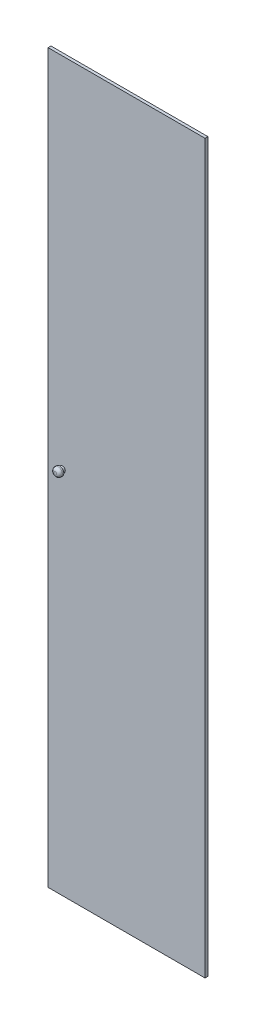
ISO-10303-21;
HEADER;
FILE_DESCRIPTION(('STEP AP214'),'2;1');
FILE_NAME('part.step','',(''),(''),'','','');
FILE_SCHEMA(('AUTOMOTIVE_DESIGN { 1 0 10303 214 1 1 1 1 }'));
ENDSEC;
DATA;
#1=APPLICATION_CONTEXT('core data for automotive mechanical design processes');
#2=APPLICATION_PROTOCOL_DEFINITION('international standard','automotive_design',2000,#1);
#3=PRODUCT_CONTEXT('',#1,'mechanical');
#4=PRODUCT('Part','Part','',(#3));
#5=PRODUCT_RELATED_PRODUCT_CATEGORY('part','',(#4));
#6=PRODUCT_DEFINITION_FORMATION('','',#4);
#7=PRODUCT_DEFINITION_CONTEXT('part definition',#1,'design');
#8=PRODUCT_DEFINITION('design','',#6,#7);
#9=PRODUCT_DEFINITION_SHAPE('','',#8);
#10=(LENGTH_UNIT() NAMED_UNIT(*) SI_UNIT(.MILLI.,.METRE.));
#11=(NAMED_UNIT(*) PLANE_ANGLE_UNIT() SI_UNIT($,.RADIAN.));
#12=(NAMED_UNIT(*) SI_UNIT($,.STERADIAN.) SOLID_ANGLE_UNIT());
#13=UNCERTAINTY_MEASURE_WITH_UNIT(LENGTH_MEASURE(1.E-05),#10,'distance_accuracy_value','');
#14=(GEOMETRIC_REPRESENTATION_CONTEXT(3) GLOBAL_UNCERTAINTY_ASSIGNED_CONTEXT((#13)) GLOBAL_UNIT_ASSIGNED_CONTEXT((#10,
#11,#12)) REPRESENTATION_CONTEXT('',''));
#15=CARTESIAN_POINT('',(0.,0.,0.));
#16=DIRECTION('',(0.,0.,1.));
#17=DIRECTION('',(1.,0.,0.));
#18=AXIS2_PLACEMENT_3D('',#15,#16,#17);
#19=CARTESIAN_POINT('',(-275.,-1275.,10.));
#20=DIRECTION('',(1.,0.,0.));
#21=DIRECTION('',(0.,1.,0.));
#22=AXIS2_PLACEMENT_3D('',#19,#20,#21);
#23=PLANE('',#22);
#24=DIRECTION('',(0.,-1.,0.));
#25=VECTOR('',#24,1.);
#26=CARTESIAN_POINT('',(-275.,-1275.,0.));
#27=LINE('',#26,#25);
#28=CARTESIAN_POINT('',(-275.,1275.,0.));
#29=VERTEX_POINT('',#28);
#30=CARTESIAN_POINT('',(-275.,-1275.,0.));
#31=VERTEX_POINT('',#30);
#32=EDGE_CURVE('E102',#29,#31,#27,.T.);
#33=ORIENTED_EDGE('',*,*,#32,.T.);
#34=DIRECTION('',(0.,0.,-1.));
#35=VECTOR('',#34,1.);
#36=CARTESIAN_POINT('',(-275.,-1275.,10.));
#37=LINE('',#36,#35);
#38=CARTESIAN_POINT('',(-275.,-1275.,10.));
#39=VERTEX_POINT('',#38);
#40=EDGE_CURVE('E93',#39,#31,#37,.T.);
#41=ORIENTED_EDGE('',*,*,#40,.F.);
#42=DIRECTION('',(0.,-1.,0.));
#43=VECTOR('',#42,1.);
#44=CARTESIAN_POINT('',(-275.,-1275.,10.));
#45=LINE('',#44,#43);
#46=CARTESIAN_POINT('',(-275.,1275.,10.));
#47=VERTEX_POINT('',#46);
#48=EDGE_CURVE('E87',#47,#39,#45,.T.);
#49=ORIENTED_EDGE('',*,*,#48,.F.);
#50=DIRECTION('',(0.,0.,-1.));
#51=VECTOR('',#50,1.);
#52=CARTESIAN_POINT('',(-275.,1275.,10.));
#53=LINE('',#52,#51);
#54=EDGE_CURVE('E98',#47,#29,#53,.T.);
#55=ORIENTED_EDGE('',*,*,#54,.T.);
#56=EDGE_LOOP('',(#33,#41,#49,#55));
#57=FACE_BOUND('',#56,.T.);
#58=ADVANCED_FACE('F34',(#57),#23,.F.);
#59=CARTESIAN_POINT('',(275.,-1275.,10.));
#60=DIRECTION('',(0.,1.,0.));
#61=DIRECTION('',(0.,0.,1.));
#62=AXIS2_PLACEMENT_3D('',#59,#60,#61);
#63=PLANE('',#62);
#64=DIRECTION('',(1.,0.,0.));
#65=VECTOR('',#64,1.);
#66=CARTESIAN_POINT('',(275.,-1275.,0.));
#67=LINE('',#66,#65);
#68=CARTESIAN_POINT('',(275.,-1275.,0.));
#69=VERTEX_POINT('',#68);
#70=EDGE_CURVE('E92',#31,#69,#67,.T.);
#71=ORIENTED_EDGE('',*,*,#70,.T.);
#72=DIRECTION('',(0.,0.,-1.));
#73=VECTOR('',#72,1.);
#74=CARTESIAN_POINT('',(275.,-1275.,10.));
#75=LINE('',#74,#73);
#76=CARTESIAN_POINT('',(275.,-1275.,10.));
#77=VERTEX_POINT('',#76);
#78=EDGE_CURVE('E90',#77,#69,#75,.T.);
#79=ORIENTED_EDGE('',*,*,#78,.F.);
#80=DIRECTION('',(1.,0.,0.));
#81=VECTOR('',#80,1.);
#82=CARTESIAN_POINT('',(275.,-1275.,10.));
#83=LINE('',#82,#81);
#84=EDGE_CURVE('E82',#39,#77,#83,.T.);
#85=ORIENTED_EDGE('',*,*,#84,.F.);
#86=ORIENTED_EDGE('',*,*,#40,.T.);
#87=EDGE_LOOP('',(#71,#79,#85,#86));
#88=FACE_BOUND('',#87,.T.);
#89=ADVANCED_FACE('F91',(#88),#63,.F.);
#90=CARTESIAN_POINT('',(275.,-1275.,10.));
#91=DIRECTION('',(-1.,0.,0.));
#92=DIRECTION('',(0.,0.,1.));
#93=AXIS2_PLACEMENT_3D('',#90,#91,#92);
#94=PLANE('',#93);
#95=DIRECTION('',(0.,1.,0.));
#96=VECTOR('',#95,1.);
#97=CARTESIAN_POINT('',(275.,-1275.,0.));
#98=LINE('',#97,#96);
#99=CARTESIAN_POINT('',(275.,1275.,0.));
#100=VERTEX_POINT('',#99);
#101=EDGE_CURVE('E68',#69,#100,#98,.T.);
#102=ORIENTED_EDGE('',*,*,#101,.T.);
#103=DIRECTION('',(0.,0.,-1.));
#104=VECTOR('',#103,1.);
#105=CARTESIAN_POINT('',(275.,1275.,10.));
#106=LINE('',#105,#104);
#107=CARTESIAN_POINT('',(275.,1275.,10.));
#108=VERTEX_POINT('',#107);
#109=EDGE_CURVE('E94',#108,#100,#106,.T.);
#110=ORIENTED_EDGE('',*,*,#109,.F.);
#111=DIRECTION('',(0.,1.,0.));
#112=VECTOR('',#111,1.);
#113=CARTESIAN_POINT('',(275.,-1275.,10.));
#114=LINE('',#113,#112);
#115=EDGE_CURVE('E85',#77,#108,#114,.T.);
#116=ORIENTED_EDGE('',*,*,#115,.F.);
#117=ORIENTED_EDGE('',*,*,#78,.T.);
#118=EDGE_LOOP('',(#102,#110,#116,#117));
#119=FACE_BOUND('',#118,.T.);
#120=ADVANCED_FACE('F96',(#119),#94,.F.);
#121=CARTESIAN_POINT('',(275.,1275.,10.));
#122=DIRECTION('',(0.,-1.,0.));
#123=DIRECTION('',(0.,0.,-1.));
#124=AXIS2_PLACEMENT_3D('',#121,#122,#123);
#125=PLANE('',#124);
#126=DIRECTION('',(-1.,0.,0.));
#127=VECTOR('',#126,1.);
#128=CARTESIAN_POINT('',(275.,1275.,0.));
#129=LINE('',#128,#127);
#130=EDGE_CURVE('E74',#100,#29,#129,.T.);
#131=ORIENTED_EDGE('',*,*,#130,.T.);
#132=ORIENTED_EDGE('',*,*,#54,.F.);
#133=DIRECTION('',(-1.,0.,0.));
#134=VECTOR('',#133,1.);
#135=CARTESIAN_POINT('',(275.,1275.,10.));
#136=LINE('',#135,#134);
#137=EDGE_CURVE('E51',#108,#47,#136,.T.);
#138=ORIENTED_EDGE('',*,*,#137,.F.);
#139=ORIENTED_EDGE('',*,*,#109,.T.);
#140=EDGE_LOOP('',(#131,#132,#138,#139));
#141=FACE_BOUND('',#140,.T.);
#142=ADVANCED_FACE('F134',(#141),#125,.F.);
#143=CARTESIAN_POINT('',(0.,0.,10.));
#144=DIRECTION('',(0.,0.,1.));
#145=DIRECTION('',(1.,0.,0.));
#146=AXIS2_PLACEMENT_3D('',#143,#144,#145);
#147=PLANE('',#146);
#148=CARTESIAN_POINT('',(-225.,20.,10.));
#149=DIRECTION('',(0.,0.,1.));
#150=DIRECTION('',(1.,0.,0.));
#151=AXIS2_PLACEMENT_3D('',#148,#149,#150);
#152=CIRCLE('',#151,10.);
#153=CARTESIAN_POINT('',(-215.,20.,10.));
#154=VERTEX_POINT('',#153);
#155=EDGE_CURVE('E222',#154,#154,#152,.T.);
#156=ORIENTED_EDGE('',*,*,#155,.F.);
#157=EDGE_LOOP('',(#156));
#158=FACE_BOUND('',#157,.T.);
#159=ORIENTED_EDGE('',*,*,#48,.T.);
#160=ORIENTED_EDGE('',*,*,#84,.T.);
#161=ORIENTED_EDGE('',*,*,#115,.T.);
#162=ORIENTED_EDGE('',*,*,#137,.T.);
#163=EDGE_LOOP('',(#159,#160,#161,#162));
#164=FACE_BOUND('',#163,.T.);
#165=ADVANCED_FACE('F83',(#158,#164),#147,.T.);
#166=CARTESIAN_POINT('',(0.,0.,0.));
#167=DIRECTION('',(0.,0.,1.));
#168=DIRECTION('',(1.,0.,0.));
#169=AXIS2_PLACEMENT_3D('',#166,#167,#168);
#170=PLANE('',#169);
#171=ORIENTED_EDGE('',*,*,#32,.F.);
#172=ORIENTED_EDGE('',*,*,#130,.F.);
#173=ORIENTED_EDGE('',*,*,#101,.F.);
#174=ORIENTED_EDGE('',*,*,#70,.F.);
#175=EDGE_LOOP('',(#171,#172,#173,#174));
#176=FACE_BOUND('',#175,.T.);
#177=ADVANCED_FACE('F137',(#176),#170,.F.);
#178=CARTESIAN_POINT('',(-225.,20.,20.));
#179=DIRECTION('',(0.,0.,-1.));
#180=DIRECTION('',(-1.,0.,0.));
#181=AXIS2_PLACEMENT_3D('',#178,#179,#180);
#182=CYLINDRICAL_SURFACE('',#181,10.);
#183=CARTESIAN_POINT('',(-225.,20.,20.));
#184=DIRECTION('',(0.,0.,1.));
#185=DIRECTION('',(1.,0.,0.));
#186=AXIS2_PLACEMENT_3D('',#183,#184,#185);
#187=CIRCLE('',#186,10.);
#188=CARTESIAN_POINT('',(-215.,20.,20.));
#189=VERTEX_POINT('',#188);
#190=EDGE_CURVE('E105',#189,#189,#187,.T.);
#191=ORIENTED_EDGE('',*,*,#190,.F.);
#192=EDGE_LOOP('',(#191));
#193=FACE_BOUND('',#192,.T.);
#194=ORIENTED_EDGE('',*,*,#155,.T.);
#195=EDGE_LOOP('',(#194));
#196=FACE_BOUND('',#195,.T.);
#197=ADVANCED_FACE('F140',(#193,#196),#182,.T.);
#198=CARTESIAN_POINT('',(-225.,20.,35.));
#199=DIRECTION('',(0.,0.,-1.));
#200=DIRECTION('',(-1.,0.,0.));
#201=AXIS2_PLACEMENT_3D('',#198,#199,#200);
#202=CYLINDRICAL_SURFACE('',#201,15.);
#203=CARTESIAN_POINT('',(-225.,20.,25.));
#204=DIRECTION('',(0.,0.,1.));
#205=DIRECTION('',(1.,0.,0.));
#206=AXIS2_PLACEMENT_3D('',#203,#204,#205);
#207=CIRCLE('',#206,15.);
#208=CARTESIAN_POINT('',(-210.,20.,25.));
#209=VERTEX_POINT('',#208);
#210=EDGE_CURVE('E11',#209,#209,#207,.F.);
#211=ORIENTED_EDGE('',*,*,#210,.T.);
#212=EDGE_LOOP('',(#211));
#213=FACE_BOUND('',#212,.T.);
#214=CARTESIAN_POINT('',(-225.,20.,20.));
#215=DIRECTION('',(0.,0.,1.));
#216=DIRECTION('',(1.,0.,0.));
#217=AXIS2_PLACEMENT_3D('',#214,#215,#216);
#218=CIRCLE('',#217,15.);
#219=CARTESIAN_POINT('',(-210.,20.,20.));
#220=VERTEX_POINT('',#219);
#221=EDGE_CURVE('E220',#220,#220,#218,.T.);
#222=ORIENTED_EDGE('',*,*,#221,.T.);
#223=EDGE_LOOP('',(#222));
#224=FACE_BOUND('',#223,.T.);
#225=ADVANCED_FACE('F147',(#213,#224),#202,.T.);
#226=CARTESIAN_POINT('',(-225.,20.,35.));
#227=DIRECTION('',(0.,0.,1.));
#228=DIRECTION('',(1.,0.,0.));
#229=AXIS2_PLACEMENT_3D('',#226,#227,#228);
#230=PLANE('',#229);
#231=CARTESIAN_POINT('',(-225.,20.,35.));
#232=DIRECTION('',(0.,0.,1.));
#233=DIRECTION('',(1.,0.,0.));
#234=AXIS2_PLACEMENT_3D('',#231,#232,#233);
#235=CIRCLE('',#234,5.00000000000002);
#236=CARTESIAN_POINT('',(-220.,20.,35.));
#237=VERTEX_POINT('',#236);
#238=EDGE_CURVE('E43',#237,#237,#235,.T.);
#239=ORIENTED_EDGE('',*,*,#238,.T.);
#240=EDGE_LOOP('',(#239));
#241=FACE_BOUND('',#240,.T.);
#242=ADVANCED_FACE('F114',(#241),#230,.T.);
#243=CARTESIAN_POINT('',(-225.,20.,20.));
#244=DIRECTION('',(0.,0.,1.));
#245=DIRECTION('',(1.,0.,0.));
#246=AXIS2_PLACEMENT_3D('',#243,#244,#245);
#247=PLANE('',#246);
#248=ORIENTED_EDGE('',*,*,#190,.T.);
#249=EDGE_LOOP('',(#248));
#250=FACE_BOUND('',#249,.T.);
#251=ORIENTED_EDGE('',*,*,#221,.F.);
#252=EDGE_LOOP('',(#251));
#253=FACE_BOUND('',#252,.T.);
#254=ADVANCED_FACE('F117',(#250,#253),#247,.F.);
#255=CARTESIAN_POINT('',(-225.,20.,25.));
#256=DIRECTION('',(0.,0.,1.));
#257=DIRECTION('',(1.,0.,0.));
#258=AXIS2_PLACEMENT_3D('',#255,#256,#257);
#259=DEGENERATE_TOROIDAL_SURFACE('',#258,5.00000000000002,10.,.T.);
#260=ORIENTED_EDGE('',*,*,#210,.F.);
#261=EDGE_LOOP('',(#260));
#262=FACE_BOUND('',#261,.T.);
#263=ORIENTED_EDGE('',*,*,#238,.F.);
#264=EDGE_LOOP('',(#263));
#265=FACE_BOUND('',#264,.T.);
#266=ADVANCED_FACE('F36',(#262,#265),#259,.T.);
#267=CLOSED_SHELL('',(#58,#89,#120,#142,#165,#177,#197,#225,#242,#254,#266));
#268=MANIFOLD_SOLID_BREP('B2',#267);
#269=ADVANCED_BREP_SHAPE_REPRESENTATION('',(#18,#268),#14);
#270=SHAPE_DEFINITION_REPRESENTATION(#9,#269);
ENDSEC;
END-ISO-10303-21;
